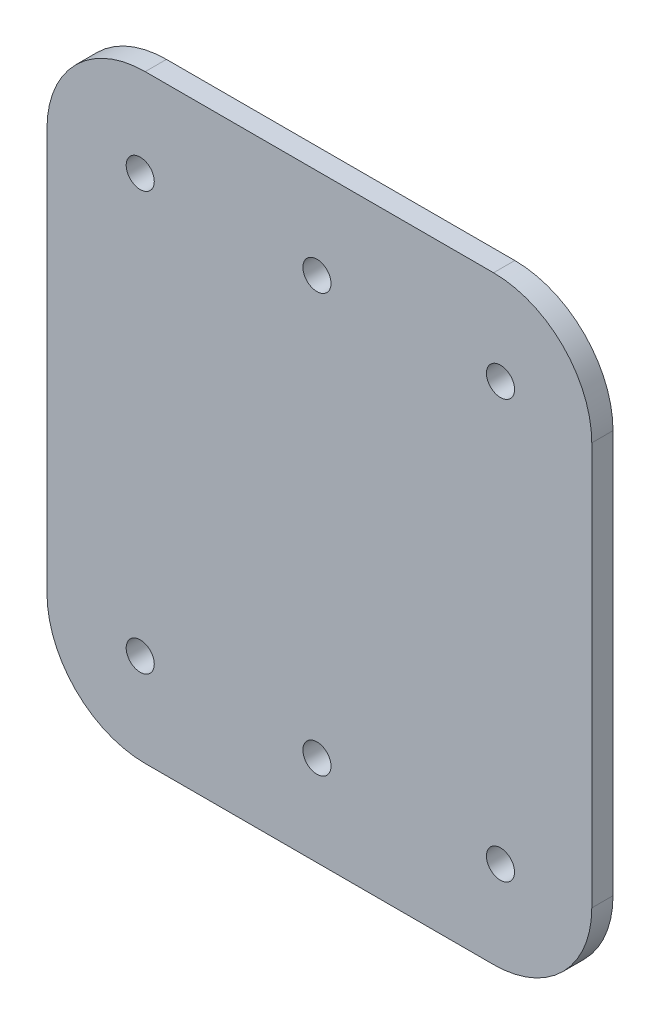
ISO-10303-21;
HEADER;
FILE_DESCRIPTION(('STEP AP214'),'2;1');
FILE_NAME('part.step','',(''),(''),'','','');
FILE_SCHEMA(('AUTOMOTIVE_DESIGN { 1 0 10303 214 1 1 1 1 }'));
ENDSEC;
DATA;
#1=APPLICATION_CONTEXT('core data for automotive mechanical design processes');
#2=APPLICATION_PROTOCOL_DEFINITION('international standard','automotive_design',2000,#1);
#3=PRODUCT_CONTEXT('',#1,'mechanical');
#4=PRODUCT('Part','Part','',(#3));
#5=PRODUCT_RELATED_PRODUCT_CATEGORY('part','',(#4));
#6=PRODUCT_DEFINITION_FORMATION('','',#4);
#7=PRODUCT_DEFINITION_CONTEXT('part definition',#1,'design');
#8=PRODUCT_DEFINITION('design','',#6,#7);
#9=PRODUCT_DEFINITION_SHAPE('','',#8);
#10=(LENGTH_UNIT() NAMED_UNIT(*) SI_UNIT(.MILLI.,.METRE.));
#11=(NAMED_UNIT(*) PLANE_ANGLE_UNIT() SI_UNIT($,.RADIAN.));
#12=(NAMED_UNIT(*) SI_UNIT($,.STERADIAN.) SOLID_ANGLE_UNIT());
#13=UNCERTAINTY_MEASURE_WITH_UNIT(LENGTH_MEASURE(1.E-05),#10,'distance_accuracy_value','');
#14=(GEOMETRIC_REPRESENTATION_CONTEXT(3) GLOBAL_UNCERTAINTY_ASSIGNED_CONTEXT((#13)) GLOBAL_UNIT_ASSIGNED_CONTEXT((#10,
#11,#12)) REPRESENTATION_CONTEXT('',''));
#15=CARTESIAN_POINT('',(0.,0.,0.));
#16=DIRECTION('',(0.,0.,1.));
#17=DIRECTION('',(1.,0.,0.));
#18=AXIS2_PLACEMENT_3D('',#15,#16,#17);
#19=CARTESIAN_POINT('',(78.104997497559,133.98499475097,3.175));
#20=DIRECTION('',(0.,0.,1.));
#21=DIRECTION('',(1.,0.,0.));
#22=AXIS2_PLACEMENT_3D('',#19,#20,#21);
#23=PLANE('',#22);
#24=CARTESIAN_POINT('',(51.708,72.644,3.175));
#25=DIRECTION('',(0.,0.,1.));
#26=DIRECTION('',(1.,0.,0.));
#27=AXIS2_PLACEMENT_3D('',#24,#25,#26);
#28=CIRCLE('',#27,2.1);
#29=CARTESIAN_POINT('',(53.808,72.644,3.175));
#30=VERTEX_POINT('',#29);
#31=EDGE_CURVE('E237',#30,#30,#28,.T.);
#32=ORIENTED_EDGE('',*,*,#31,.F.);
#33=EDGE_LOOP('',(#32));
#34=FACE_BOUND('',#33,.T.);
#35=CARTESIAN_POINT('',(79.14,135.128,3.175));
#36=DIRECTION('',(0.,0.,1.));
#37=DIRECTION('',(1.,0.,0.));
#38=AXIS2_PLACEMENT_3D('',#35,#36,#37);
#39=CIRCLE('',#38,2.1);
#40=CARTESIAN_POINT('',(81.24,135.128,3.175));
#41=VERTEX_POINT('',#40);
#42=EDGE_CURVE('E221',#41,#41,#39,.T.);
#43=ORIENTED_EDGE('',*,*,#42,.F.);
#44=EDGE_LOOP('',(#43));
#45=FACE_BOUND('',#44,.T.);
#46=CARTESIAN_POINT('',(25.292,135.128,3.175));
#47=DIRECTION('',(0.,0.,1.));
#48=DIRECTION('',(1.,0.,0.));
#49=AXIS2_PLACEMENT_3D('',#46,#47,#48);
#50=CIRCLE('',#49,2.1);
#51=CARTESIAN_POINT('',(27.392,135.128,3.175));
#52=VERTEX_POINT('',#51);
#53=EDGE_CURVE('E146',#52,#52,#50,.T.);
#54=ORIENTED_EDGE('',*,*,#53,.F.);
#55=EDGE_LOOP('',(#54));
#56=FACE_BOUND('',#55,.T.);
#57=CARTESIAN_POINT('',(78.104997497559,133.98499475097,3.175));
#58=DIRECTION('',(0.,0.,1.));
#59=DIRECTION('',(1.,0.,0.));
#60=AXIS2_PLACEMENT_3D('',#57,#58,#59);
#61=CIRCLE('',#60,14.6812);
#62=CARTESIAN_POINT('',(92.786197497559,133.98499475097,3.175));
#63=VERTEX_POINT('',#62);
#64=CARTESIAN_POINT('',(78.104997497559,148.66619475097,3.175));
#65=VERTEX_POINT('',#64);
#66=EDGE_CURVE('E164',#63,#65,#61,.T.);
#67=ORIENTED_EDGE('',*,*,#66,.T.);
#68=DIRECTION('',(-1.,0.,0.));
#69=VECTOR('',#68,1.);
#70=CARTESIAN_POINT('',(78.104997497559,148.66619475097,3.175));
#71=LINE('',#70,#69);
#72=CARTESIAN_POINT('',(26.034999984741,148.66619475097,3.175));
#73=VERTEX_POINT('',#72);
#74=EDGE_CURVE('E100',#65,#73,#71,.T.);
#75=ORIENTED_EDGE('',*,*,#74,.T.);
#76=CARTESIAN_POINT('',(26.034999984741,133.98499475097,3.175));
#77=DIRECTION('',(0.,0.,1.));
#78=DIRECTION('',(1.,0.,0.));
#79=AXIS2_PLACEMENT_3D('',#76,#77,#78);
#80=CIRCLE('',#79,14.6812);
#81=CARTESIAN_POINT('',(11.353799984741,133.98499475097,3.175));
#82=VERTEX_POINT('',#81);
#83=EDGE_CURVE('E185',#73,#82,#80,.T.);
#84=ORIENTED_EDGE('',*,*,#83,.T.);
#85=DIRECTION('',(0.,-1.,0.));
#86=VECTOR('',#85,1.);
#87=CARTESIAN_POINT('',(11.353799984741,133.98499475097,3.175));
#88=LINE('',#87,#86);
#89=CARTESIAN_POINT('',(11.353799984741,73.787000793457,3.175));
#90=VERTEX_POINT('',#89);
#91=EDGE_CURVE('E199',#82,#90,#88,.T.);
#92=ORIENTED_EDGE('',*,*,#91,.T.);
#93=CARTESIAN_POINT('',(26.034999984741,73.787000793457,3.175));
#94=DIRECTION('',(0.,0.,1.));
#95=DIRECTION('',(1.,0.,0.));
#96=AXIS2_PLACEMENT_3D('',#93,#94,#95);
#97=CIRCLE('',#96,14.6812);
#98=CARTESIAN_POINT('',(26.034999984741,59.105800793457,3.175));
#99=VERTEX_POINT('',#98);
#100=EDGE_CURVE('E119',#90,#99,#97,.T.);
#101=ORIENTED_EDGE('',*,*,#100,.T.);
#102=DIRECTION('',(1.,0.,0.));
#103=VECTOR('',#102,1.);
#104=CARTESIAN_POINT('',(26.034999984741,59.105800793457,3.175));
#105=LINE('',#104,#103);
#106=CARTESIAN_POINT('',(78.104997497559,59.105800793457,3.175));
#107=VERTEX_POINT('',#106);
#108=EDGE_CURVE('E113',#99,#107,#105,.T.);
#109=ORIENTED_EDGE('',*,*,#108,.T.);
#110=CARTESIAN_POINT('',(78.104997497559,73.787000793457,3.175));
#111=DIRECTION('',(0.,0.,1.));
#112=DIRECTION('',(1.,0.,0.));
#113=AXIS2_PLACEMENT_3D('',#110,#111,#112);
#114=CIRCLE('',#113,14.6812);
#115=CARTESIAN_POINT('',(92.786197497559,73.787000793457,3.175));
#116=VERTEX_POINT('',#115);
#117=EDGE_CURVE('E117',#107,#116,#114,.T.);
#118=ORIENTED_EDGE('',*,*,#117,.T.);
#119=DIRECTION('',(0.,1.,0.));
#120=VECTOR('',#119,1.);
#121=CARTESIAN_POINT('',(92.786197497559,73.787000793457,3.175));
#122=LINE('',#121,#120);
#123=EDGE_CURVE('E57',#116,#63,#122,.T.);
#124=ORIENTED_EDGE('',*,*,#123,.T.);
#125=EDGE_LOOP('',(#67,#75,#84,#92,#101,#109,#118,#124));
#126=FACE_BOUND('',#125,.T.);
#127=CARTESIAN_POINT('',(51.708,135.128,3.175));
#128=DIRECTION('',(0.,0.,1.));
#129=DIRECTION('',(1.,0.,0.));
#130=AXIS2_PLACEMENT_3D('',#127,#128,#129);
#131=CIRCLE('',#130,2.09999999999999);
#132=CARTESIAN_POINT('',(53.808,135.128,3.175));
#133=VERTEX_POINT('',#132);
#134=EDGE_CURVE('E213',#133,#133,#131,.T.);
#135=ORIENTED_EDGE('',*,*,#134,.F.);
#136=EDGE_LOOP('',(#135));
#137=FACE_BOUND('',#136,.T.);
#138=CARTESIAN_POINT('',(79.14,72.644,3.175));
#139=DIRECTION('',(0.,0.,1.));
#140=DIRECTION('',(1.,0.,0.));
#141=AXIS2_PLACEMENT_3D('',#138,#139,#140);
#142=CIRCLE('',#141,2.1);
#143=CARTESIAN_POINT('',(81.24,72.644,3.175));
#144=VERTEX_POINT('',#143);
#145=EDGE_CURVE('E229',#144,#144,#142,.T.);
#146=ORIENTED_EDGE('',*,*,#145,.F.);
#147=EDGE_LOOP('',(#146));
#148=FACE_BOUND('',#147,.T.);
#149=CARTESIAN_POINT('',(25.292,72.644,3.175));
#150=DIRECTION('',(0.,0.,1.));
#151=DIRECTION('',(1.,0.,0.));
#152=AXIS2_PLACEMENT_3D('',#149,#150,#151);
#153=CIRCLE('',#152,2.1);
#154=CARTESIAN_POINT('',(27.392,72.644,3.175));
#155=VERTEX_POINT('',#154);
#156=EDGE_CURVE('E245',#155,#155,#153,.T.);
#157=ORIENTED_EDGE('',*,*,#156,.F.);
#158=EDGE_LOOP('',(#157));
#159=FACE_BOUND('',#158,.T.);
#160=ADVANCED_FACE('F39',(#34,#45,#56,#126,#137,#148,#159),#23,.T.);
#161=CARTESIAN_POINT('',(78.104997497559,133.98499475097,0.));
#162=DIRECTION('',(0.,0.,1.));
#163=DIRECTION('',(1.,0.,0.));
#164=AXIS2_PLACEMENT_3D('',#161,#162,#163);
#165=PLANE('',#164);
#166=CARTESIAN_POINT('',(78.104997497559,133.98499475097,0.));
#167=DIRECTION('',(0.,0.,1.));
#168=DIRECTION('',(1.,0.,0.));
#169=AXIS2_PLACEMENT_3D('',#166,#167,#168);
#170=CIRCLE('',#169,14.6812);
#171=CARTESIAN_POINT('',(92.786197497559,133.98499475097,0.));
#172=VERTEX_POINT('',#171);
#173=CARTESIAN_POINT('',(78.104997497559,148.66619475097,0.));
#174=VERTEX_POINT('',#173);
#175=EDGE_CURVE('E141',#172,#174,#170,.T.);
#176=ORIENTED_EDGE('',*,*,#175,.F.);
#177=DIRECTION('',(0.,1.,0.));
#178=VECTOR('',#177,1.);
#179=CARTESIAN_POINT('',(92.786197497559,73.787000793457,0.));
#180=LINE('',#179,#178);
#181=CARTESIAN_POINT('',(92.786197497559,73.787000793457,0.));
#182=VERTEX_POINT('',#181);
#183=EDGE_CURVE('E92',#182,#172,#180,.T.);
#184=ORIENTED_EDGE('',*,*,#183,.F.);
#185=CARTESIAN_POINT('',(78.104997497559,73.787000793457,0.));
#186=DIRECTION('',(0.,0.,1.));
#187=DIRECTION('',(1.,0.,0.));
#188=AXIS2_PLACEMENT_3D('',#185,#186,#187);
#189=CIRCLE('',#188,14.6812);
#190=CARTESIAN_POINT('',(78.104997497559,59.105800793457,0.));
#191=VERTEX_POINT('',#190);
#192=EDGE_CURVE('E86',#191,#182,#189,.T.);
#193=ORIENTED_EDGE('',*,*,#192,.F.);
#194=DIRECTION('',(1.,0.,0.));
#195=VECTOR('',#194,1.);
#196=CARTESIAN_POINT('',(26.034999984741,59.105800793457,0.));
#197=LINE('',#196,#195);
#198=CARTESIAN_POINT('',(26.034999984741,59.105800793457,0.));
#199=VERTEX_POINT('',#198);
#200=EDGE_CURVE('E128',#199,#191,#197,.T.);
#201=ORIENTED_EDGE('',*,*,#200,.F.);
#202=CARTESIAN_POINT('',(26.034999984741,73.787000793457,0.));
#203=DIRECTION('',(0.,0.,1.));
#204=DIRECTION('',(1.,0.,0.));
#205=AXIS2_PLACEMENT_3D('',#202,#203,#204);
#206=CIRCLE('',#205,14.6812);
#207=CARTESIAN_POINT('',(11.353799984741,73.787000793457,0.));
#208=VERTEX_POINT('',#207);
#209=EDGE_CURVE('E155',#208,#199,#206,.T.);
#210=ORIENTED_EDGE('',*,*,#209,.F.);
#211=DIRECTION('',(0.,-1.,0.));
#212=VECTOR('',#211,1.);
#213=CARTESIAN_POINT('',(11.353799984741,133.98499475097,0.));
#214=LINE('',#213,#212);
#215=CARTESIAN_POINT('',(11.353799984741,133.98499475097,0.));
#216=VERTEX_POINT('',#215);
#217=EDGE_CURVE('E152',#216,#208,#214,.T.);
#218=ORIENTED_EDGE('',*,*,#217,.F.);
#219=CARTESIAN_POINT('',(26.034999984741,133.98499475097,0.));
#220=DIRECTION('',(0.,0.,1.));
#221=DIRECTION('',(1.,0.,0.));
#222=AXIS2_PLACEMENT_3D('',#219,#220,#221);
#223=CIRCLE('',#222,14.6812);
#224=CARTESIAN_POINT('',(26.034999984741,148.66619475097,0.));
#225=VERTEX_POINT('',#224);
#226=EDGE_CURVE('E149',#225,#216,#223,.T.);
#227=ORIENTED_EDGE('',*,*,#226,.F.);
#228=DIRECTION('',(-1.,0.,0.));
#229=VECTOR('',#228,1.);
#230=CARTESIAN_POINT('',(78.104997497559,148.66619475097,0.));
#231=LINE('',#230,#229);
#232=EDGE_CURVE('E145',#174,#225,#231,.T.);
#233=ORIENTED_EDGE('',*,*,#232,.F.);
#234=EDGE_LOOP('',(#176,#184,#193,#201,#210,#218,#227,#233));
#235=FACE_BOUND('',#234,.T.);
#236=CARTESIAN_POINT('',(25.292,135.128,0.));
#237=DIRECTION('',(0.,0.,1.));
#238=DIRECTION('',(1.,0.,0.));
#239=AXIS2_PLACEMENT_3D('',#236,#237,#238);
#240=CIRCLE('',#239,2.1);
#241=CARTESIAN_POINT('',(27.392,135.128,0.));
#242=VERTEX_POINT('',#241);
#243=EDGE_CURVE('E209',#242,#242,#240,.T.);
#244=ORIENTED_EDGE('',*,*,#243,.T.);
#245=EDGE_LOOP('',(#244));
#246=FACE_BOUND('',#245,.T.);
#247=CARTESIAN_POINT('',(51.708,135.128,0.));
#248=DIRECTION('',(0.,0.,1.));
#249=DIRECTION('',(1.,0.,0.));
#250=AXIS2_PLACEMENT_3D('',#247,#248,#249);
#251=CIRCLE('',#250,2.09999999999999);
#252=CARTESIAN_POINT('',(53.808,135.128,0.));
#253=VERTEX_POINT('',#252);
#254=EDGE_CURVE('E217',#253,#253,#251,.T.);
#255=ORIENTED_EDGE('',*,*,#254,.T.);
#256=EDGE_LOOP('',(#255));
#257=FACE_BOUND('',#256,.T.);
#258=CARTESIAN_POINT('',(79.14,135.128,0.));
#259=DIRECTION('',(0.,0.,1.));
#260=DIRECTION('',(1.,0.,0.));
#261=AXIS2_PLACEMENT_3D('',#258,#259,#260);
#262=CIRCLE('',#261,2.1);
#263=CARTESIAN_POINT('',(81.24,135.128,0.));
#264=VERTEX_POINT('',#263);
#265=EDGE_CURVE('E225',#264,#264,#262,.T.);
#266=ORIENTED_EDGE('',*,*,#265,.T.);
#267=EDGE_LOOP('',(#266));
#268=FACE_BOUND('',#267,.T.);
#269=CARTESIAN_POINT('',(79.14,72.644,0.));
#270=DIRECTION('',(0.,0.,1.));
#271=DIRECTION('',(1.,0.,0.));
#272=AXIS2_PLACEMENT_3D('',#269,#270,#271);
#273=CIRCLE('',#272,2.1);
#274=CARTESIAN_POINT('',(81.24,72.644,0.));
#275=VERTEX_POINT('',#274);
#276=EDGE_CURVE('E233',#275,#275,#273,.T.);
#277=ORIENTED_EDGE('',*,*,#276,.T.);
#278=EDGE_LOOP('',(#277));
#279=FACE_BOUND('',#278,.T.);
#280=CARTESIAN_POINT('',(51.708,72.644,0.));
#281=DIRECTION('',(0.,0.,1.));
#282=DIRECTION('',(1.,0.,0.));
#283=AXIS2_PLACEMENT_3D('',#280,#281,#282);
#284=CIRCLE('',#283,2.1);
#285=CARTESIAN_POINT('',(53.808,72.644,0.));
#286=VERTEX_POINT('',#285);
#287=EDGE_CURVE('E241',#286,#286,#284,.T.);
#288=ORIENTED_EDGE('',*,*,#287,.T.);
#289=EDGE_LOOP('',(#288));
#290=FACE_BOUND('',#289,.T.);
#291=CARTESIAN_POINT('',(25.292,72.644,0.));
#292=DIRECTION('',(0.,0.,1.));
#293=DIRECTION('',(1.,0.,0.));
#294=AXIS2_PLACEMENT_3D('',#291,#292,#293);
#295=CIRCLE('',#294,2.1);
#296=CARTESIAN_POINT('',(27.392,72.644,0.));
#297=VERTEX_POINT('',#296);
#298=EDGE_CURVE('E249',#297,#297,#295,.T.);
#299=ORIENTED_EDGE('',*,*,#298,.T.);
#300=EDGE_LOOP('',(#299));
#301=FACE_BOUND('',#300,.T.);
#302=ADVANCED_FACE('F189',(#235,#246,#257,#268,#279,#290,#301),#165,.F.);
#303=CARTESIAN_POINT('',(78.104997497559,133.98499475097,3.175));
#304=DIRECTION('',(0.,0.,-1.));
#305=DIRECTION('',(-1.,0.,0.));
#306=AXIS2_PLACEMENT_3D('',#303,#304,#305);
#307=CYLINDRICAL_SURFACE('',#306,14.6812);
#308=ORIENTED_EDGE('',*,*,#175,.T.);
#309=DIRECTION('',(0.,0.,-1.));
#310=VECTOR('',#309,1.);
#311=CARTESIAN_POINT('',(78.104997497559,148.66619475097,3.175));
#312=LINE('',#311,#310);
#313=EDGE_CURVE('E11',#65,#174,#312,.T.);
#314=ORIENTED_EDGE('',*,*,#313,.F.);
#315=ORIENTED_EDGE('',*,*,#66,.F.);
#316=DIRECTION('',(0.,0.,-1.));
#317=VECTOR('',#316,1.);
#318=CARTESIAN_POINT('',(92.786197497559,133.98499475097,3.175));
#319=LINE('',#318,#317);
#320=EDGE_CURVE('E137',#63,#172,#319,.T.);
#321=ORIENTED_EDGE('',*,*,#320,.T.);
#322=EDGE_LOOP('',(#308,#314,#315,#321));
#323=FACE_BOUND('',#322,.T.);
#324=ADVANCED_FACE('F41',(#323),#307,.T.);
#325=CARTESIAN_POINT('',(78.104997497559,148.66619475097,3.175));
#326=DIRECTION('',(0.,-1.,0.));
#327=DIRECTION('',(0.,0.,-1.));
#328=AXIS2_PLACEMENT_3D('',#325,#326,#327);
#329=PLANE('',#328);
#330=ORIENTED_EDGE('',*,*,#232,.T.);
#331=DIRECTION('',(0.,0.,-1.));
#332=VECTOR('',#331,1.);
#333=CARTESIAN_POINT('',(26.034999984741,148.66619475097,3.175));
#334=LINE('',#333,#332);
#335=EDGE_CURVE('E49',#73,#225,#334,.T.);
#336=ORIENTED_EDGE('',*,*,#335,.F.);
#337=ORIENTED_EDGE('',*,*,#74,.F.);
#338=ORIENTED_EDGE('',*,*,#313,.T.);
#339=EDGE_LOOP('',(#330,#336,#337,#338));
#340=FACE_BOUND('',#339,.T.);
#341=ADVANCED_FACE('F285',(#340),#329,.F.);
#342=CARTESIAN_POINT('',(26.034999984741,133.98499475097,3.175));
#343=DIRECTION('',(0.,0.,-1.));
#344=DIRECTION('',(-1.,0.,0.));
#345=AXIS2_PLACEMENT_3D('',#342,#343,#344);
#346=CYLINDRICAL_SURFACE('',#345,14.6812);
#347=ORIENTED_EDGE('',*,*,#226,.T.);
#348=DIRECTION('',(0.,0.,-1.));
#349=VECTOR('',#348,1.);
#350=CARTESIAN_POINT('',(11.353799984741,133.98499475097,3.175));
#351=LINE('',#350,#349);
#352=EDGE_CURVE('E175',#82,#216,#351,.T.);
#353=ORIENTED_EDGE('',*,*,#352,.F.);
#354=ORIENTED_EDGE('',*,*,#83,.F.);
#355=ORIENTED_EDGE('',*,*,#335,.T.);
#356=EDGE_LOOP('',(#347,#353,#354,#355));
#357=FACE_BOUND('',#356,.T.);
#358=ADVANCED_FACE('F183',(#357),#346,.T.);
#359=CARTESIAN_POINT('',(11.353799984741,133.98499475097,3.175));
#360=DIRECTION('',(1.,0.,0.));
#361=DIRECTION('',(0.,1.,0.));
#362=AXIS2_PLACEMENT_3D('',#359,#360,#361);
#363=PLANE('',#362);
#364=ORIENTED_EDGE('',*,*,#217,.T.);
#365=DIRECTION('',(0.,0.,-1.));
#366=VECTOR('',#365,1.);
#367=CARTESIAN_POINT('',(11.353799984741,73.787000793457,3.175));
#368=LINE('',#367,#366);
#369=EDGE_CURVE('E171',#90,#208,#368,.T.);
#370=ORIENTED_EDGE('',*,*,#369,.F.);
#371=ORIENTED_EDGE('',*,*,#91,.F.);
#372=ORIENTED_EDGE('',*,*,#352,.T.);
#373=EDGE_LOOP('',(#364,#370,#371,#372));
#374=FACE_BOUND('',#373,.T.);
#375=ADVANCED_FACE('F194',(#374),#363,.F.);
#376=CARTESIAN_POINT('',(26.034999984741,73.787000793457,3.175));
#377=DIRECTION('',(0.,0.,-1.));
#378=DIRECTION('',(-1.,0.,0.));
#379=AXIS2_PLACEMENT_3D('',#376,#377,#378);
#380=CYLINDRICAL_SURFACE('',#379,14.6812);
#381=ORIENTED_EDGE('',*,*,#209,.T.);
#382=DIRECTION('',(0.,0.,-1.));
#383=VECTOR('',#382,1.);
#384=CARTESIAN_POINT('',(26.034999984741,59.105800793457,3.175));
#385=LINE('',#384,#383);
#386=EDGE_CURVE('E130',#99,#199,#385,.T.);
#387=ORIENTED_EDGE('',*,*,#386,.F.);
#388=ORIENTED_EDGE('',*,*,#100,.F.);
#389=ORIENTED_EDGE('',*,*,#369,.T.);
#390=EDGE_LOOP('',(#381,#387,#388,#389));
#391=FACE_BOUND('',#390,.T.);
#392=ADVANCED_FACE('F197',(#391),#380,.T.);
#393=CARTESIAN_POINT('',(26.034999984741,59.105800793457,3.175));
#394=DIRECTION('',(0.,1.,0.));
#395=DIRECTION('',(0.,0.,1.));
#396=AXIS2_PLACEMENT_3D('',#393,#394,#395);
#397=PLANE('',#396);
#398=ORIENTED_EDGE('',*,*,#200,.T.);
#399=DIRECTION('',(0.,0.,-1.));
#400=VECTOR('',#399,1.);
#401=CARTESIAN_POINT('',(78.104997497559,59.105800793457,3.175));
#402=LINE('',#401,#400);
#403=EDGE_CURVE('E125',#107,#191,#402,.T.);
#404=ORIENTED_EDGE('',*,*,#403,.F.);
#405=ORIENTED_EDGE('',*,*,#108,.F.);
#406=ORIENTED_EDGE('',*,*,#386,.T.);
#407=EDGE_LOOP('',(#398,#404,#405,#406));
#408=FACE_BOUND('',#407,.T.);
#409=ADVANCED_FACE('F126',(#408),#397,.F.);
#410=CARTESIAN_POINT('',(78.104997497559,73.787000793457,3.175));
#411=DIRECTION('',(0.,0.,-1.));
#412=DIRECTION('',(-1.,0.,0.));
#413=AXIS2_PLACEMENT_3D('',#410,#411,#412);
#414=CYLINDRICAL_SURFACE('',#413,14.6812);
#415=ORIENTED_EDGE('',*,*,#192,.T.);
#416=DIRECTION('',(0.,0.,-1.));
#417=VECTOR('',#416,1.);
#418=CARTESIAN_POINT('',(92.786197497559,73.787000793457,3.175));
#419=LINE('',#418,#417);
#420=EDGE_CURVE('E131',#116,#182,#419,.T.);
#421=ORIENTED_EDGE('',*,*,#420,.F.);
#422=ORIENTED_EDGE('',*,*,#117,.F.);
#423=ORIENTED_EDGE('',*,*,#403,.T.);
#424=EDGE_LOOP('',(#415,#421,#422,#423));
#425=FACE_BOUND('',#424,.T.);
#426=ADVANCED_FACE('F133',(#425),#414,.T.);
#427=CARTESIAN_POINT('',(92.786197497559,73.787000793457,3.175));
#428=DIRECTION('',(-1.,0.,0.));
#429=DIRECTION('',(0.,0.,1.));
#430=AXIS2_PLACEMENT_3D('',#427,#428,#429);
#431=PLANE('',#430);
#432=ORIENTED_EDGE('',*,*,#183,.T.);
#433=ORIENTED_EDGE('',*,*,#320,.F.);
#434=ORIENTED_EDGE('',*,*,#123,.F.);
#435=ORIENTED_EDGE('',*,*,#420,.T.);
#436=EDGE_LOOP('',(#432,#433,#434,#435));
#437=FACE_BOUND('',#436,.T.);
#438=ADVANCED_FACE('F273',(#437),#431,.F.);
#439=CARTESIAN_POINT('',(25.292,135.128,3.175));
#440=DIRECTION('',(0.,0.,-1.));
#441=DIRECTION('',(-1.,0.,0.));
#442=AXIS2_PLACEMENT_3D('',#439,#440,#441);
#443=CYLINDRICAL_SURFACE('',#442,2.1);
#444=ORIENTED_EDGE('',*,*,#53,.T.);
#445=EDGE_LOOP('',(#444));
#446=FACE_BOUND('',#445,.T.);
#447=ORIENTED_EDGE('',*,*,#243,.F.);
#448=EDGE_LOOP('',(#447));
#449=FACE_BOUND('',#448,.T.);
#450=ADVANCED_FACE('F270',(#446,#449),#443,.F.);
#451=CARTESIAN_POINT('',(51.708,135.128,3.175));
#452=DIRECTION('',(0.,0.,-1.));
#453=DIRECTION('',(-1.,0.,0.));
#454=AXIS2_PLACEMENT_3D('',#451,#452,#453);
#455=CYLINDRICAL_SURFACE('',#454,2.09999999999999);
#456=ORIENTED_EDGE('',*,*,#134,.T.);
#457=EDGE_LOOP('',(#456));
#458=FACE_BOUND('',#457,.T.);
#459=ORIENTED_EDGE('',*,*,#254,.F.);
#460=EDGE_LOOP('',(#459));
#461=FACE_BOUND('',#460,.T.);
#462=ADVANCED_FACE('F349',(#458,#461),#455,.F.);
#463=CARTESIAN_POINT('',(79.14,135.128,3.175));
#464=DIRECTION('',(0.,0.,-1.));
#465=DIRECTION('',(-1.,0.,0.));
#466=AXIS2_PLACEMENT_3D('',#463,#464,#465);
#467=CYLINDRICAL_SURFACE('',#466,2.1);
#468=ORIENTED_EDGE('',*,*,#42,.T.);
#469=EDGE_LOOP('',(#468));
#470=FACE_BOUND('',#469,.T.);
#471=ORIENTED_EDGE('',*,*,#265,.F.);
#472=EDGE_LOOP('',(#471));
#473=FACE_BOUND('',#472,.T.);
#474=ADVANCED_FACE('F357',(#470,#473),#467,.F.);
#475=CARTESIAN_POINT('',(79.14,72.644,3.175));
#476=DIRECTION('',(0.,0.,-1.));
#477=DIRECTION('',(-1.,0.,0.));
#478=AXIS2_PLACEMENT_3D('',#475,#476,#477);
#479=CYLINDRICAL_SURFACE('',#478,2.1);
#480=ORIENTED_EDGE('',*,*,#145,.T.);
#481=EDGE_LOOP('',(#480));
#482=FACE_BOUND('',#481,.T.);
#483=ORIENTED_EDGE('',*,*,#276,.F.);
#484=EDGE_LOOP('',(#483));
#485=FACE_BOUND('',#484,.T.);
#486=ADVANCED_FACE('F365',(#482,#485),#479,.F.);
#487=CARTESIAN_POINT('',(51.708,72.644,3.175));
#488=DIRECTION('',(0.,0.,-1.));
#489=DIRECTION('',(-1.,0.,0.));
#490=AXIS2_PLACEMENT_3D('',#487,#488,#489);
#491=CYLINDRICAL_SURFACE('',#490,2.1);
#492=ORIENTED_EDGE('',*,*,#31,.T.);
#493=EDGE_LOOP('',(#492));
#494=FACE_BOUND('',#493,.T.);
#495=ORIENTED_EDGE('',*,*,#287,.F.);
#496=EDGE_LOOP('',(#495));
#497=FACE_BOUND('',#496,.T.);
#498=ADVANCED_FACE('F374',(#494,#497),#491,.F.);
#499=CARTESIAN_POINT('',(25.292,72.644,3.175));
#500=DIRECTION('',(0.,0.,-1.));
#501=DIRECTION('',(-1.,0.,0.));
#502=AXIS2_PLACEMENT_3D('',#499,#500,#501);
#503=CYLINDRICAL_SURFACE('',#502,2.1);
#504=ORIENTED_EDGE('',*,*,#156,.T.);
#505=EDGE_LOOP('',(#504));
#506=FACE_BOUND('',#505,.T.);
#507=ORIENTED_EDGE('',*,*,#298,.F.);
#508=EDGE_LOOP('',(#507));
#509=FACE_BOUND('',#508,.T.);
#510=ADVANCED_FACE('F257',(#506,#509),#503,.F.);
#511=CLOSED_SHELL('',(#160,#302,#324,#341,#358,#375,#392,#409,#426,#438,#450,#462,#474,#486,
#498,#510));
#512=MANIFOLD_SOLID_BREP('B2',#511);
#513=ADVANCED_BREP_SHAPE_REPRESENTATION('',(#18,#512),#14);
#514=SHAPE_DEFINITION_REPRESENTATION(#9,#513);
ENDSEC;
END-ISO-10303-21;
